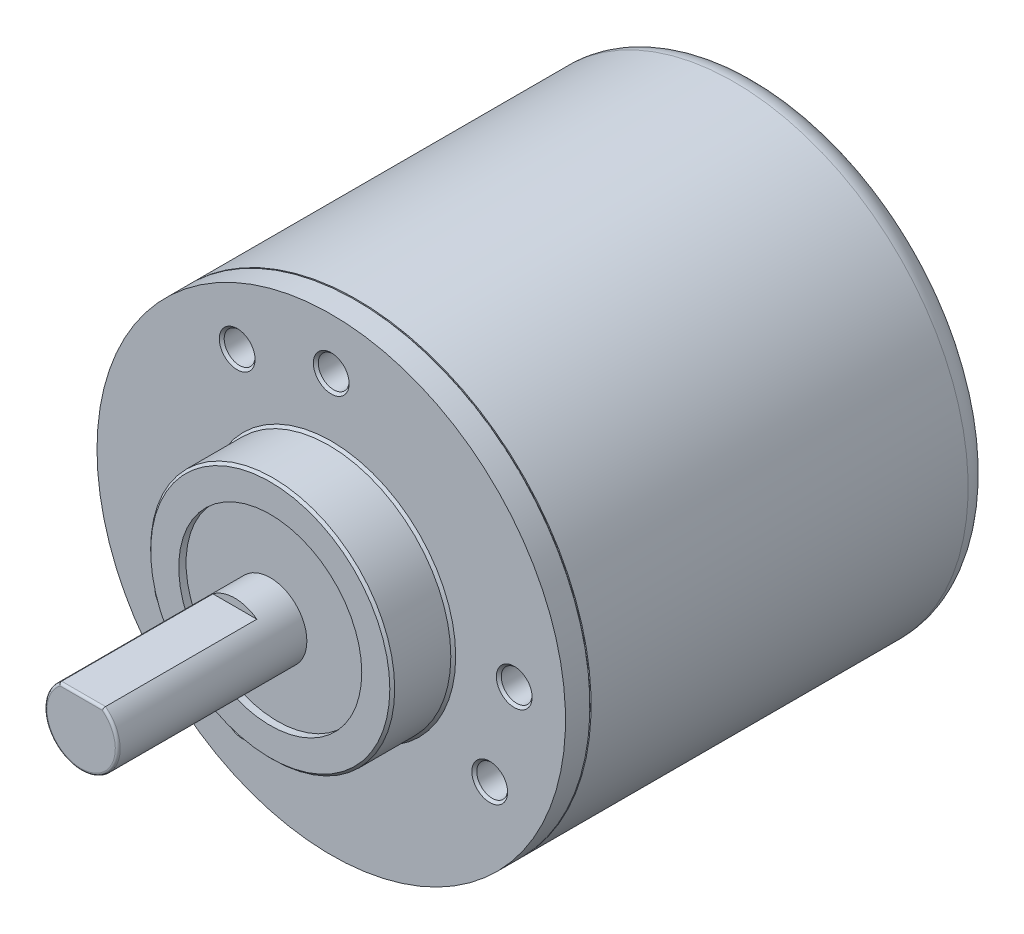
ISO-10303-21;
HEADER;
FILE_DESCRIPTION(('STEP AP214'),'2;1');
FILE_NAME('part.step','',(''),(''),'','','');
FILE_SCHEMA(('AUTOMOTIVE_DESIGN { 1 0 10303 214 1 1 1 1 }'));
ENDSEC;
DATA;
#1=APPLICATION_CONTEXT('core data for automotive mechanical design processes');
#2=APPLICATION_PROTOCOL_DEFINITION('international standard','automotive_design',2000,#1);
#3=PRODUCT_CONTEXT('',#1,'mechanical');
#4=PRODUCT('Part','Part','',(#3));
#5=PRODUCT_RELATED_PRODUCT_CATEGORY('part','',(#4));
#6=PRODUCT_DEFINITION_FORMATION('','',#4);
#7=PRODUCT_DEFINITION_CONTEXT('part definition',#1,'design');
#8=PRODUCT_DEFINITION('design','',#6,#7);
#9=PRODUCT_DEFINITION_SHAPE('','',#8);
#10=(LENGTH_UNIT() NAMED_UNIT(*) SI_UNIT(.MILLI.,.METRE.));
#11=(NAMED_UNIT(*) PLANE_ANGLE_UNIT() SI_UNIT($,.RADIAN.));
#12=(NAMED_UNIT(*) SI_UNIT($,.STERADIAN.) SOLID_ANGLE_UNIT());
#13=UNCERTAINTY_MEASURE_WITH_UNIT(LENGTH_MEASURE(1.E-05),#10,'distance_accuracy_value','');
#14=(GEOMETRIC_REPRESENTATION_CONTEXT(3) GLOBAL_UNCERTAINTY_ASSIGNED_CONTEXT((#13)) GLOBAL_UNIT_ASSIGNED_CONTEXT((#10,
#11,#12)) REPRESENTATION_CONTEXT('',''));
#15=CARTESIAN_POINT('',(0.,0.,0.));
#16=DIRECTION('',(0.,0.,1.));
#17=DIRECTION('',(1.,0.,0.));
#18=AXIS2_PLACEMENT_3D('',#15,#16,#17);
#19=CARTESIAN_POINT('',(0.,15.,28.));
#20=DIRECTION('',(0.,0.,1.));
#21=DIRECTION('',(1.,0.,0.));
#22=AXIS2_PLACEMENT_3D('',#19,#20,#21);
#23=PLANE('',#22);
#24=CARTESIAN_POINT('',(0.,15.,28.));
#25=DIRECTION('',(0.,0.,-1.));
#26=DIRECTION('',(-1.,0.,0.));
#27=AXIS2_PLACEMENT_3D('',#24,#25,#26);
#28=CIRCLE('',#27,1.2645);
#29=CARTESIAN_POINT('',(1.2645,15.,28.));
#30=VERTEX_POINT('',#29);
#31=EDGE_CURVE('P0_E255',#30,#30,#28,.T.);
#32=ORIENTED_EDGE('',*,*,#31,.F.);
#33=EDGE_LOOP('',(#32));
#34=FACE_BOUND('',#33,.T.);
#35=ADVANCED_FACE('P0_F17',(#34),#23,.T.);
#36=CARTESIAN_POINT('',(-12.9903810567666,-7.5,28.));
#37=DIRECTION('',(0.,0.,1.));
#38=DIRECTION('',(1.,0.,0.));
#39=AXIS2_PLACEMENT_3D('',#36,#37,#38);
#40=PLANE('',#39);
#41=CARTESIAN_POINT('',(-12.9903810567666,-7.5,28.));
#42=DIRECTION('',(0.,0.,-1.));
#43=DIRECTION('',(0.5,-0.866025403784439,0.));
#44=AXIS2_PLACEMENT_3D('',#41,#42,#43);
#45=CIRCLE('',#44,1.2645);
#46=CARTESIAN_POINT('',(-13.6226310567666,-6.40491087691458,28.));
#47=VERTEX_POINT('',#46);
#48=EDGE_CURVE('P0_E199',#47,#47,#45,.T.);
#49=ORIENTED_EDGE('',*,*,#48,.F.);
#50=EDGE_LOOP('',(#49));
#51=FACE_BOUND('',#50,.T.);
#52=ADVANCED_FACE('P0_F586',(#51),#40,.T.);
#53=CARTESIAN_POINT('',(12.9903810567666,-7.5,28.));
#54=DIRECTION('',(0.,0.,1.));
#55=DIRECTION('',(1.,0.,0.));
#56=AXIS2_PLACEMENT_3D('',#53,#54,#55);
#57=PLANE('',#56);
#58=CARTESIAN_POINT('',(12.9903810567666,-7.5,28.));
#59=DIRECTION('',(0.,0.,-1.));
#60=DIRECTION('',(0.5,0.866025403784438,0.));
#61=AXIS2_PLACEMENT_3D('',#58,#59,#60);
#62=CIRCLE('',#61,1.2645);
#63=CARTESIAN_POINT('',(12.3581310567666,-8.59508912308543,28.));
#64=VERTEX_POINT('',#63);
#65=EDGE_CURVE('P0_E162',#64,#64,#62,.T.);
#66=ORIENTED_EDGE('',*,*,#65,.F.);
#67=EDGE_LOOP('',(#66));
#68=FACE_BOUND('',#67,.T.);
#69=ADVANCED_FACE('P0_F517',(#68),#57,.T.);
#70=CARTESIAN_POINT('',(-7.71031055722718,12.8666666666667,28.));
#71=DIRECTION('',(0.,0.,1.));
#72=DIRECTION('',(1.,0.,0.));
#73=AXIS2_PLACEMENT_3D('',#70,#71,#72);
#74=PLANE('',#73);
#75=CARTESIAN_POINT('',(-7.71031055722718,12.8666666666667,28.));
#76=DIRECTION('',(0.,0.,-1.));
#77=DIRECTION('',(-1.,0.,0.));
#78=AXIS2_PLACEMENT_3D('',#75,#76,#77);
#79=CIRCLE('',#78,1.2645);
#80=CARTESIAN_POINT('',(-6.44581055722718,12.8666666666667,28.));
#81=VERTEX_POINT('',#80);
#82=EDGE_CURVE('P0_E251',#81,#81,#79,.T.);
#83=ORIENTED_EDGE('',*,*,#82,.F.);
#84=EDGE_LOOP('',(#83));
#85=FACE_BOUND('',#84,.T.);
#86=ADVANCED_FACE('P0_F403',(#85),#74,.T.);
#87=CARTESIAN_POINT('',(-7.2877049167462,-13.1106581469594,28.));
#88=DIRECTION('',(0.,0.,1.));
#89=DIRECTION('',(1.,0.,0.));
#90=AXIS2_PLACEMENT_3D('',#87,#88,#89);
#91=PLANE('',#90);
#92=CARTESIAN_POINT('',(-7.2877049167462,-13.1106581469594,28.));
#93=DIRECTION('',(0.,0.,-1.));
#94=DIRECTION('',(0.5,-0.866025403784439,0.));
#95=AXIS2_PLACEMENT_3D('',#92,#93,#94);
#96=CIRCLE('',#95,1.2645);
#97=CARTESIAN_POINT('',(-7.9199549167462,-12.015569023874,28.));
#98=VERTEX_POINT('',#97);
#99=EDGE_CURVE('P0_E224',#98,#98,#96,.T.);
#100=ORIENTED_EDGE('',*,*,#99,.F.);
#101=EDGE_LOOP('',(#100));
#102=FACE_BOUND('',#101,.T.);
#103=ADVANCED_FACE('P0_F397',(#102),#91,.T.);
#104=CARTESIAN_POINT('',(14.9980154739734,0.243991480292745,28.));
#105=DIRECTION('',(0.,0.,1.));
#106=DIRECTION('',(1.,0.,0.));
#107=AXIS2_PLACEMENT_3D('',#104,#105,#106);
#108=PLANE('',#107);
#109=CARTESIAN_POINT('',(14.9980154739734,0.243991480292745,28.));
#110=DIRECTION('',(0.,0.,-1.));
#111=DIRECTION('',(0.5,0.866025403784438,0.));
#112=AXIS2_PLACEMENT_3D('',#109,#110,#111);
#113=CIRCLE('',#112,1.2645);
#114=CARTESIAN_POINT('',(14.3657654739734,-0.851097642792678,28.));
#115=VERTEX_POINT('',#114);
#116=EDGE_CURVE('P0_E237',#115,#115,#113,.T.);
#117=ORIENTED_EDGE('',*,*,#116,.F.);
#118=EDGE_LOOP('',(#117));
#119=FACE_BOUND('',#118,.T.);
#120=ADVANCED_FACE('P0_F402',(#119),#108,.T.);
#121=CARTESIAN_POINT('',(0.,0.,0.));
#122=DIRECTION('',(0.,0.,1.));
#123=DIRECTION('',(1.,0.,0.));
#124=AXIS2_PLACEMENT_3D('',#121,#122,#123);
#125=PLANE('',#124);
#126=CARTESIAN_POINT('',(0.,0.,0.));
#127=DIRECTION('',(0.,0.,1.));
#128=DIRECTION('',(1.,0.,0.));
#129=AXIS2_PLACEMENT_3D('',#126,#127,#128);
#130=CIRCLE('',#129,17.2);
#131=CARTESIAN_POINT('',(-17.2,0.,0.));
#132=VERTEX_POINT('',#131);
#133=EDGE_CURVE('P0_E25',#132,#132,#130,.T.);
#134=ORIENTED_EDGE('',*,*,#133,.F.);
#135=EDGE_LOOP('',(#134));
#136=FACE_BOUND('',#135,.T.);
#137=ADVANCED_FACE('P0_F544',(#136),#125,.F.);
#138=CARTESIAN_POINT('',(0.,0.,0.));
#139=DIRECTION('',(0.,0.,1.));
#140=DIRECTION('',(1.,0.,0.));
#141=AXIS2_PLACEMENT_3D('',#138,#139,#140);
#142=CYLINDRICAL_SURFACE('',#141,19.2);
#143=CARTESIAN_POINT('',(0.,0.,32.9));
#144=DIRECTION('',(0.,0.,-1.));
#145=DIRECTION('',(1.,0.,0.));
#146=AXIS2_PLACEMENT_3D('',#143,#144,#145);
#147=CIRCLE('',#146,19.2);
#148=CARTESIAN_POINT('',(-19.2,0.,32.9));
#149=VERTEX_POINT('',#148);
#150=EDGE_CURVE('P0_E214',#149,#149,#147,.T.);
#151=ORIENTED_EDGE('',*,*,#150,.T.);
#152=DIRECTION('',(0.,0.,-1.));
#153=VECTOR('',#152,1.);
#154=CARTESIAN_POINT('',(-19.2,0.,0.));
#155=LINE('',#154,#153);
#156=CARTESIAN_POINT('',(-19.2,0.,2.));
#157=VERTEX_POINT('',#156);
#158=EDGE_CURVE('P0_E11',#149,#157,#155,.T.);
#159=ORIENTED_EDGE('',*,*,#158,.T.);
#160=CARTESIAN_POINT('',(0.,0.,2.));
#161=DIRECTION('',(0.,0.,-1.));
#162=DIRECTION('',(1.,0.,0.));
#163=AXIS2_PLACEMENT_3D('',#160,#161,#162);
#164=CIRCLE('',#163,19.2);
#165=EDGE_CURVE('P0_E307',#157,#157,#164,.T.);
#166=ORIENTED_EDGE('',*,*,#165,.F.);
#167=ORIENTED_EDGE('',*,*,#158,.F.);
#168=EDGE_LOOP('',(#151,#159,#166,#167));
#169=FACE_BOUND('',#168,.T.);
#170=ADVANCED_FACE('P0_F562',(#169),#142,.T.);
#171=CARTESIAN_POINT('',(0.,0.,2.));
#172=DIRECTION('',(0.,0.,1.));
#173=DIRECTION('',(1.,0.,0.));
#174=AXIS2_PLACEMENT_3D('',#171,#172,#173);
#175=TOROIDAL_SURFACE('',#174,17.2,2.);
#176=ORIENTED_EDGE('',*,*,#165,.T.);
#177=CARTESIAN_POINT('',(-17.2,0.,2.));
#178=DIRECTION('',(0.,-1.,0.));
#179=DIRECTION('',(-1.,0.,0.));
#180=AXIS2_PLACEMENT_3D('',#177,#178,#179);
#181=CIRCLE('',#180,2.);
#182=EDGE_CURVE('P0_E311',#157,#132,#181,.T.);
#183=ORIENTED_EDGE('',*,*,#182,.T.);
#184=ORIENTED_EDGE('',*,*,#133,.T.);
#185=ORIENTED_EDGE('',*,*,#182,.F.);
#186=EDGE_LOOP('',(#176,#183,#184,#185));
#187=FACE_BOUND('',#186,.T.);
#188=ADVANCED_FACE('P0_F553',(#187),#175,.T.);
#189=CARTESIAN_POINT('',(0.,0.,35.1));
#190=DIRECTION('',(0.,0.,-1.));
#191=DIRECTION('',(-1.,0.,0.));
#192=AXIS2_PLACEMENT_3D('',#189,#190,#191);
#193=CONICAL_SURFACE('',#192,10.1,0.785398163397448);
#194=CARTESIAN_POINT('',(0.,0.,35.));
#195=DIRECTION('',(0.,0.,1.));
#196=DIRECTION('',(-1.,0.,0.));
#197=AXIS2_PLACEMENT_3D('',#194,#195,#196);
#198=CIRCLE('',#197,10.2);
#199=CARTESIAN_POINT('',(10.2,0.,35.));
#200=VERTEX_POINT('',#199);
#201=EDGE_CURVE('P0_E183',#200,#200,#198,.T.);
#202=ORIENTED_EDGE('',*,*,#201,.T.);
#203=DIRECTION('',(-0.707106781186548,0.,0.707106781186548));
#204=VECTOR('',#203,1.);
#205=CARTESIAN_POINT('',(10.1,0.,35.1));
#206=LINE('',#205,#204);
#207=CARTESIAN_POINT('',(10.,0.,35.2));
#208=VERTEX_POINT('',#207);
#209=EDGE_CURVE('P0_E304',#200,#208,#206,.T.);
#210=ORIENTED_EDGE('',*,*,#209,.T.);
#211=CARTESIAN_POINT('',(0.,0.,35.2));
#212=DIRECTION('',(0.,0.,-1.));
#213=DIRECTION('',(-1.,0.,0.));
#214=AXIS2_PLACEMENT_3D('',#211,#212,#213);
#215=CIRCLE('',#214,10.);
#216=EDGE_CURVE('P0_E262',#208,#208,#215,.T.);
#217=ORIENTED_EDGE('',*,*,#216,.T.);
#218=ORIENTED_EDGE('',*,*,#209,.F.);
#219=EDGE_LOOP('',(#202,#210,#217,#218));
#220=FACE_BOUND('',#219,.T.);
#221=ADVANCED_FACE('P0_F535',(#220),#193,.T.);
#222=CARTESIAN_POINT('',(0.,0.,40.));
#223=DIRECTION('',(0.,0.,1.));
#224=DIRECTION('',(1.,0.,0.));
#225=AXIS2_PLACEMENT_3D('',#222,#223,#224);
#226=PLANE('',#225);
#227=CARTESIAN_POINT('',(0.,0.,40.));
#228=DIRECTION('',(0.,0.,-1.));
#229=DIRECTION('',(-1.,0.,0.));
#230=AXIS2_PLACEMENT_3D('',#227,#228,#229);
#231=CIRCLE('',#230,7.5);
#232=CARTESIAN_POINT('',(7.5,0.,40.));
#233=VERTEX_POINT('',#232);
#234=EDGE_CURVE('P0_E279',#233,#233,#231,.T.);
#235=ORIENTED_EDGE('',*,*,#234,.T.);
#236=EDGE_LOOP('',(#235));
#237=FACE_BOUND('',#236,.T.);
#238=CARTESIAN_POINT('',(0.,0.,40.));
#239=DIRECTION('',(0.,0.,-1.));
#240=DIRECTION('',(-1.,0.,0.));
#241=AXIS2_PLACEMENT_3D('',#238,#239,#240);
#242=CIRCLE('',#241,9.8);
#243=CARTESIAN_POINT('',(9.8,0.,40.));
#244=VERTEX_POINT('',#243);
#245=EDGE_CURVE('P0_E290',#244,#244,#242,.T.);
#246=ORIENTED_EDGE('',*,*,#245,.F.);
#247=EDGE_LOOP('',(#246));
#248=FACE_BOUND('',#247,.T.);
#249=ADVANCED_FACE('P0_F526',(#237,#248),#226,.T.);
#250=CARTESIAN_POINT('',(0.,0.,35.));
#251=DIRECTION('',(0.,0.,1.));
#252=DIRECTION('',(-1.,0.,0.));
#253=AXIS2_PLACEMENT_3D('',#250,#251,#252);
#254=CYLINDRICAL_SURFACE('',#253,10.);
#255=CARTESIAN_POINT('',(0.,0.,39.8));
#256=DIRECTION('',(0.,0.,1.));
#257=DIRECTION('',(-1.,0.,0.));
#258=AXIS2_PLACEMENT_3D('',#255,#256,#257);
#259=CIRCLE('',#258,10.);
#260=CARTESIAN_POINT('',(10.,0.,39.8));
#261=VERTEX_POINT('',#260);
#262=EDGE_CURVE('P0_E263',#261,#261,#259,.T.);
#263=ORIENTED_EDGE('',*,*,#262,.F.);
#264=DIRECTION('',(0.,0.,-1.));
#265=VECTOR('',#264,1.);
#266=CARTESIAN_POINT('',(10.,0.,35.));
#267=LINE('',#266,#265);
#268=EDGE_CURVE('P0_E258',#261,#208,#267,.T.);
#269=ORIENTED_EDGE('',*,*,#268,.T.);
#270=ORIENTED_EDGE('',*,*,#216,.F.);
#271=ORIENTED_EDGE('',*,*,#268,.F.);
#272=EDGE_LOOP('',(#263,#269,#270,#271));
#273=FACE_BOUND('',#272,.T.);
#274=ADVANCED_FACE('P0_F508',(#273),#254,.T.);
#275=CARTESIAN_POINT('',(0.,0.,39.9));
#276=DIRECTION('',(0.,0.,-1.));
#277=DIRECTION('',(-1.,0.,0.));
#278=AXIS2_PLACEMENT_3D('',#275,#276,#277);
#279=CONICAL_SURFACE('',#278,9.9,0.785398163397448);
#280=ORIENTED_EDGE('',*,*,#245,.T.);
#281=DIRECTION('',(0.707106781186548,0.,-0.707106781186548));
#282=VECTOR('',#281,1.);
#283=CARTESIAN_POINT('',(9.9,0.,39.9));
#284=LINE('',#283,#282);
#285=EDGE_CURVE('P0_E294',#244,#261,#284,.T.);
#286=ORIENTED_EDGE('',*,*,#285,.T.);
#287=ORIENTED_EDGE('',*,*,#262,.T.);
#288=ORIENTED_EDGE('',*,*,#285,.F.);
#289=EDGE_LOOP('',(#280,#286,#287,#288));
#290=FACE_BOUND('',#289,.T.);
#291=ADVANCED_FACE('P0_F360',(#290),#279,.T.);
#292=CARTESIAN_POINT('',(0.,0.,39.4));
#293=DIRECTION('',(0.,0.,1.));
#294=DIRECTION('',(1.,0.,0.));
#295=AXIS2_PLACEMENT_3D('',#292,#293,#294);
#296=PLANE('',#295);
#297=CARTESIAN_POINT('',(0.,0.,39.4));
#298=DIRECTION('',(0.,0.,-1.));
#299=DIRECTION('',(-1.,0.,0.));
#300=AXIS2_PLACEMENT_3D('',#297,#298,#299);
#301=CIRCLE('',#300,7.5);
#302=CARTESIAN_POINT('',(7.5,0.,39.4));
#303=VERTEX_POINT('',#302);
#304=EDGE_CURVE('P0_E287',#303,#303,#301,.T.);
#305=ORIENTED_EDGE('',*,*,#304,.F.);
#306=EDGE_LOOP('',(#305));
#307=FACE_BOUND('',#306,.T.);
#308=ADVANCED_FACE('P0_F354',(#307),#296,.T.);
#309=CARTESIAN_POINT('',(0.,0.,40.));
#310=DIRECTION('',(0.,0.,-1.));
#311=DIRECTION('',(-1.,0.,0.));
#312=AXIS2_PLACEMENT_3D('',#309,#310,#311);
#313=CYLINDRICAL_SURFACE('',#312,7.5);
#314=ORIENTED_EDGE('',*,*,#234,.F.);
#315=DIRECTION('',(0.,0.,-1.));
#316=VECTOR('',#315,1.);
#317=CARTESIAN_POINT('',(7.5,0.,40.));
#318=LINE('',#317,#316);
#319=EDGE_CURVE('P0_E283',#233,#303,#318,.T.);
#320=ORIENTED_EDGE('',*,*,#319,.T.);
#321=ORIENTED_EDGE('',*,*,#304,.T.);
#322=ORIENTED_EDGE('',*,*,#319,.F.);
#323=EDGE_LOOP('',(#314,#320,#321,#322));
#324=FACE_BOUND('',#323,.T.);
#325=ADVANCED_FACE('P0_F359',(#324),#313,.F.);
#326=CARTESIAN_POINT('',(0.,0.,0.));
#327=DIRECTION('',(0.,0.,1.));
#328=DIRECTION('',(1.,0.,0.));
#329=AXIS2_PLACEMENT_3D('',#326,#327,#328);
#330=CYLINDRICAL_SURFACE('',#329,19.2);
#331=CARTESIAN_POINT('',(0.,0.,35.));
#332=DIRECTION('',(0.,0.,1.));
#333=DIRECTION('',(1.,0.,0.));
#334=AXIS2_PLACEMENT_3D('',#331,#332,#333);
#335=CIRCLE('',#334,19.2);
#336=CARTESIAN_POINT('',(-19.2,0.,35.));
#337=VERTEX_POINT('',#336);
#338=EDGE_CURVE('P0_E719',#337,#337,#335,.T.);
#339=ORIENTED_EDGE('',*,*,#338,.F.);
#340=DIRECTION('',(0.,0.,-1.));
#341=VECTOR('',#340,1.);
#342=CARTESIAN_POINT('',(-19.2,0.,0.));
#343=LINE('',#342,#341);
#344=CARTESIAN_POINT('',(-19.2,0.,33.));
#345=VERTEX_POINT('',#344);
#346=EDGE_CURVE('P0_E276',#337,#345,#343,.T.);
#347=ORIENTED_EDGE('',*,*,#346,.T.);
#348=CARTESIAN_POINT('',(0.,0.,33.));
#349=DIRECTION('',(0.,0.,1.));
#350=DIRECTION('',(1.,0.,0.));
#351=AXIS2_PLACEMENT_3D('',#348,#349,#350);
#352=CIRCLE('',#351,19.2);
#353=EDGE_CURVE('P0_E272',#345,#345,#352,.T.);
#354=ORIENTED_EDGE('',*,*,#353,.T.);
#355=ORIENTED_EDGE('',*,*,#346,.F.);
#356=EDGE_LOOP('',(#339,#347,#354,#355));
#357=FACE_BOUND('',#356,.T.);
#358=ADVANCED_FACE('P0_F485',(#357),#330,.T.);
#359=CARTESIAN_POINT('',(0.,19.2,33.));
#360=DIRECTION('',(0.,0.,1.));
#361=DIRECTION('',(1.,0.,0.));
#362=AXIS2_PLACEMENT_3D('',#359,#360,#361);
#363=PLANE('',#362);
#364=CARTESIAN_POINT('',(0.,0.,33.));
#365=DIRECTION('',(0.,0.,-1.));
#366=DIRECTION('',(1.,0.,0.));
#367=AXIS2_PLACEMENT_3D('',#364,#365,#366);
#368=CIRCLE('',#367,19.1);
#369=CARTESIAN_POINT('',(0.,-19.1,33.));
#370=VERTEX_POINT('',#369);
#371=EDGE_CURVE('P0_E213',#370,#370,#368,.T.);
#372=ORIENTED_EDGE('',*,*,#371,.F.);
#373=EDGE_LOOP('',(#372));
#374=FACE_BOUND('',#373,.T.);
#375=ORIENTED_EDGE('',*,*,#353,.F.);
#376=EDGE_LOOP('',(#375));
#377=FACE_BOUND('',#376,.T.);
#378=ADVANCED_FACE('P0_F476',(#374,#377),#363,.F.);
#379=CARTESIAN_POINT('',(0.,0.,32.95));
#380=DIRECTION('',(0.,0.,-1.));
#381=DIRECTION('',(0.,1.,0.));
#382=AXIS2_PLACEMENT_3D('',#379,#380,#381);
#383=CYLINDRICAL_SURFACE('',#382,19.1);
#384=ORIENTED_EDGE('',*,*,#371,.T.);
#385=DIRECTION('',(0.,0.,-1.));
#386=VECTOR('',#385,1.);
#387=CARTESIAN_POINT('',(0.,-19.1,32.95));
#388=LINE('',#387,#386);
#389=CARTESIAN_POINT('',(0.,-19.1,32.9));
#390=VERTEX_POINT('',#389);
#391=EDGE_CURVE('P0_E269',#370,#390,#388,.T.);
#392=ORIENTED_EDGE('',*,*,#391,.T.);
#393=CARTESIAN_POINT('',(0.,0.,32.9));
#394=DIRECTION('',(0.,0.,-1.));
#395=DIRECTION('',(1.,0.,0.));
#396=AXIS2_PLACEMENT_3D('',#393,#394,#395);
#397=CIRCLE('',#396,19.1);
#398=EDGE_CURVE('P0_E209',#390,#390,#397,.T.);
#399=ORIENTED_EDGE('',*,*,#398,.F.);
#400=ORIENTED_EDGE('',*,*,#391,.F.);
#401=EDGE_LOOP('',(#384,#392,#399,#400));
#402=FACE_BOUND('',#401,.T.);
#403=ADVANCED_FACE('P0_F347',(#402),#383,.T.);
#404=CARTESIAN_POINT('',(0.,19.1,32.9));
#405=DIRECTION('',(0.,0.,-1.));
#406=DIRECTION('',(0.,-1.,0.));
#407=AXIS2_PLACEMENT_3D('',#404,#405,#406);
#408=PLANE('',#407);
#409=ORIENTED_EDGE('',*,*,#398,.T.);
#410=EDGE_LOOP('',(#409));
#411=FACE_BOUND('',#410,.T.);
#412=ORIENTED_EDGE('',*,*,#150,.F.);
#413=EDGE_LOOP('',(#412));
#414=FACE_BOUND('',#413,.T.);
#415=ADVANCED_FACE('P0_F341',(#411,#414),#408,.F.);
#416=CARTESIAN_POINT('',(0.,15.,35.));
#417=DIRECTION('',(0.,0.,-1.));
#418=DIRECTION('',(-1.,0.,0.));
#419=AXIS2_PLACEMENT_3D('',#416,#417,#418);
#420=CYLINDRICAL_SURFACE('',#419,1.2645);
#421=CARTESIAN_POINT('',(0.,15.,34.8));
#422=DIRECTION('',(0.,0.,-1.));
#423=DIRECTION('',(-1.,0.,0.));
#424=AXIS2_PLACEMENT_3D('',#421,#422,#423);
#425=CIRCLE('',#424,1.2645);
#426=CARTESIAN_POINT('',(1.2645,15.,34.8));
#427=VERTEX_POINT('',#426);
#428=EDGE_CURVE('P0_E204',#427,#427,#425,.T.);
#429=ORIENTED_EDGE('',*,*,#428,.F.);
#430=DIRECTION('',(0.,0.,-1.));
#431=VECTOR('',#430,1.);
#432=CARTESIAN_POINT('',(1.2645,15.,35.));
#433=LINE('',#432,#431);
#434=EDGE_CURVE('P0_E203',#427,#30,#433,.T.);
#435=ORIENTED_EDGE('',*,*,#434,.T.);
#436=ORIENTED_EDGE('',*,*,#31,.T.);
#437=ORIENTED_EDGE('',*,*,#434,.F.);
#438=EDGE_LOOP('',(#429,#435,#436,#437));
#439=FACE_BOUND('',#438,.T.);
#440=ADVANCED_FACE('P0_F346',(#439),#420,.F.);
#441=CARTESIAN_POINT('',(0.,15.,34.9));
#442=DIRECTION('',(0.,0.,1.));
#443=DIRECTION('',(-1.,0.,0.));
#444=AXIS2_PLACEMENT_3D('',#441,#442,#443);
#445=CONICAL_SURFACE('',#444,1.3645,0.785398163397448);
#446=ORIENTED_EDGE('',*,*,#428,.T.);
#447=DIRECTION('',(0.707106781186548,0.,0.707106781186548));
#448=VECTOR('',#447,1.);
#449=CARTESIAN_POINT('',(1.3645,15.,34.9));
#450=LINE('',#449,#448);
#451=CARTESIAN_POINT('',(1.4645,15.,35.));
#452=VERTEX_POINT('',#451);
#453=EDGE_CURVE('P0_E200',#427,#452,#450,.T.);
#454=ORIENTED_EDGE('',*,*,#453,.T.);
#455=CARTESIAN_POINT('',(0.,15.,35.));
#456=DIRECTION('',(0.,0.,1.));
#457=DIRECTION('',(-1.,0.,0.));
#458=AXIS2_PLACEMENT_3D('',#455,#456,#457);
#459=CIRCLE('',#458,1.4645);
#460=EDGE_CURVE('P0_E717',#452,#452,#459,.T.);
#461=ORIENTED_EDGE('',*,*,#460,.T.);
#462=ORIENTED_EDGE('',*,*,#453,.F.);
#463=EDGE_LOOP('',(#446,#454,#461,#462));
#464=FACE_BOUND('',#463,.T.);
#465=ADVANCED_FACE('P0_F450',(#464),#445,.F.);
#466=CARTESIAN_POINT('',(-7.71031055722718,12.8666666666667,35.));
#467=DIRECTION('',(0.,0.,-1.));
#468=DIRECTION('',(-1.,0.,0.));
#469=AXIS2_PLACEMENT_3D('',#466,#467,#468);
#470=CYLINDRICAL_SURFACE('',#469,1.2645);
#471=CARTESIAN_POINT('',(-7.71031055722718,12.8666666666667,34.8));
#472=DIRECTION('',(0.,0.,-1.));
#473=DIRECTION('',(-1.,0.,0.));
#474=AXIS2_PLACEMENT_3D('',#471,#472,#473);
#475=CIRCLE('',#474,1.2645);
#476=CARTESIAN_POINT('',(-6.44581055722718,12.8666666666667,34.8));
#477=VERTEX_POINT('',#476);
#478=EDGE_CURVE('P0_E240',#477,#477,#475,.T.);
#479=ORIENTED_EDGE('',*,*,#478,.F.);
#480=DIRECTION('',(0.,0.,-1.));
#481=VECTOR('',#480,1.);
#482=CARTESIAN_POINT('',(-6.44581055722718,12.8666666666667,35.));
#483=LINE('',#482,#481);
#484=EDGE_CURVE('P0_E247',#477,#81,#483,.T.);
#485=ORIENTED_EDGE('',*,*,#484,.T.);
#486=ORIENTED_EDGE('',*,*,#82,.T.);
#487=ORIENTED_EDGE('',*,*,#484,.F.);
#488=EDGE_LOOP('',(#479,#485,#486,#487));
#489=FACE_BOUND('',#488,.T.);
#490=ADVANCED_FACE('P0_F422',(#489),#470,.F.);
#491=CARTESIAN_POINT('',(-7.71031055722718,12.8666666666667,34.9));
#492=DIRECTION('',(0.,0.,1.));
#493=DIRECTION('',(-1.,0.,0.));
#494=AXIS2_PLACEMENT_3D('',#491,#492,#493);
#495=CONICAL_SURFACE('',#494,1.3645,0.785398163397448);
#496=ORIENTED_EDGE('',*,*,#478,.T.);
#497=DIRECTION('',(0.707106781186548,0.,0.707106781186548));
#498=VECTOR('',#497,1.);
#499=CARTESIAN_POINT('',(-6.34581055722718,12.8666666666667,34.9));
#500=LINE('',#499,#498);
#501=CARTESIAN_POINT('',(-6.24581055722718,12.8666666666667,35.));
#502=VERTEX_POINT('',#501);
#503=EDGE_CURVE('P0_E244',#477,#502,#500,.T.);
#504=ORIENTED_EDGE('',*,*,#503,.T.);
#505=CARTESIAN_POINT('',(-7.71031055722718,12.8666666666667,35.));
#506=DIRECTION('',(0.,0.,1.));
#507=DIRECTION('',(-1.,0.,0.));
#508=AXIS2_PLACEMENT_3D('',#505,#506,#507);
#509=CIRCLE('',#508,1.4645);
#510=EDGE_CURVE('P0_E189',#502,#502,#509,.T.);
#511=ORIENTED_EDGE('',*,*,#510,.T.);
#512=ORIENTED_EDGE('',*,*,#503,.F.);
#513=EDGE_LOOP('',(#496,#504,#511,#512));
#514=FACE_BOUND('',#513,.T.);
#515=ADVANCED_FACE('P0_F382',(#514),#495,.F.);
#516=CARTESIAN_POINT('',(14.9980154739734,0.243991480292745,35.));
#517=DIRECTION('',(0.,0.,-1.));
#518=DIRECTION('',(0.5,0.866025403784438,0.));
#519=AXIS2_PLACEMENT_3D('',#516,#517,#518);
#520=CYLINDRICAL_SURFACE('',#519,1.2645);
#521=CARTESIAN_POINT('',(14.9980154739734,0.243991480292745,34.8));
#522=DIRECTION('',(0.,0.,-1.));
#523=DIRECTION('',(0.5,0.866025403784439,0.));
#524=AXIS2_PLACEMENT_3D('',#521,#522,#523);
#525=CIRCLE('',#524,1.2645);
#526=CARTESIAN_POINT('',(14.3657654739734,-0.851097642792678,34.8));
#527=VERTEX_POINT('',#526);
#528=EDGE_CURVE('P0_E169',#527,#527,#525,.T.);
#529=ORIENTED_EDGE('',*,*,#528,.F.);
#530=DIRECTION('',(0.,0.,-1.));
#531=VECTOR('',#530,1.);
#532=CARTESIAN_POINT('',(14.3657654739734,-0.851097642792678,35.));
#533=LINE('',#532,#531);
#534=EDGE_CURVE('P0_E233',#527,#115,#533,.T.);
#535=ORIENTED_EDGE('',*,*,#534,.T.);
#536=ORIENTED_EDGE('',*,*,#116,.T.);
#537=ORIENTED_EDGE('',*,*,#534,.F.);
#538=EDGE_LOOP('',(#529,#535,#536,#537));
#539=FACE_BOUND('',#538,.T.);
#540=ADVANCED_FACE('P0_F376',(#539),#520,.F.);
#541=CARTESIAN_POINT('',(14.9980154739734,0.243991480292745,34.9));
#542=DIRECTION('',(0.,0.,1.));
#543=DIRECTION('',(0.5,0.866025403784439,0.));
#544=AXIS2_PLACEMENT_3D('',#541,#542,#543);
#545=CONICAL_SURFACE('',#544,1.3645,0.785398163397448);
#546=ORIENTED_EDGE('',*,*,#528,.T.);
#547=DIRECTION('',(-0.353553390593275,-0.612372435695794,0.707106781186548));
#548=VECTOR('',#547,1.);
#549=CARTESIAN_POINT('',(14.3157654739734,-0.937700183171122,34.9));
#550=LINE('',#549,#548);
#551=CARTESIAN_POINT('',(14.2657654739734,-1.02430272354957,35.));
#552=VERTEX_POINT('',#551);
#553=EDGE_CURVE('P0_E176',#527,#552,#550,.T.);
#554=ORIENTED_EDGE('',*,*,#553,.T.);
#555=CARTESIAN_POINT('',(14.9980154739734,0.243991480292745,35.));
#556=DIRECTION('',(0.,0.,1.));
#557=DIRECTION('',(0.5,0.866025403784439,0.));
#558=AXIS2_PLACEMENT_3D('',#555,#556,#557);
#559=CIRCLE('',#558,1.4645);
#560=EDGE_CURVE('P0_E185',#552,#552,#559,.T.);
#561=ORIENTED_EDGE('',*,*,#560,.T.);
#562=ORIENTED_EDGE('',*,*,#553,.F.);
#563=EDGE_LOOP('',(#546,#554,#561,#562));
#564=FACE_BOUND('',#563,.T.);
#565=ADVANCED_FACE('P0_F381',(#564),#545,.F.);
#566=CARTESIAN_POINT('',(12.9903810567666,-7.5,35.));
#567=DIRECTION('',(0.,0.,-1.));
#568=DIRECTION('',(0.5,0.866025403784438,0.));
#569=AXIS2_PLACEMENT_3D('',#566,#567,#568);
#570=CYLINDRICAL_SURFACE('',#569,1.2645);
#571=CARTESIAN_POINT('',(12.9903810567666,-7.5,34.8));
#572=DIRECTION('',(0.,0.,-1.));
#573=DIRECTION('',(0.5,0.866025403784439,0.));
#574=AXIS2_PLACEMENT_3D('',#571,#572,#573);
#575=CIRCLE('',#574,1.2645);
#576=CARTESIAN_POINT('',(12.3581310567666,-8.59508912308543,34.8));
#577=VERTEX_POINT('',#576);
#578=EDGE_CURVE('P0_E225',#577,#577,#575,.T.);
#579=ORIENTED_EDGE('',*,*,#578,.F.);
#580=DIRECTION('',(0.,0.,-1.));
#581=VECTOR('',#580,1.);
#582=CARTESIAN_POINT('',(12.3581310567666,-8.59508912308543,35.));
#583=LINE('',#582,#581);
#584=EDGE_CURVE('P0_E165',#577,#64,#583,.T.);
#585=ORIENTED_EDGE('',*,*,#584,.T.);
#586=ORIENTED_EDGE('',*,*,#65,.T.);
#587=ORIENTED_EDGE('',*,*,#584,.F.);
#588=EDGE_LOOP('',(#579,#585,#586,#587));
#589=FACE_BOUND('',#588,.T.);
#590=ADVANCED_FACE('P0_F164',(#589),#570,.F.);
#591=CARTESIAN_POINT('',(12.9903810567666,-7.5,34.9));
#592=DIRECTION('',(0.,0.,1.));
#593=DIRECTION('',(0.5,0.866025403784439,0.));
#594=AXIS2_PLACEMENT_3D('',#591,#592,#593);
#595=CONICAL_SURFACE('',#594,1.3645,0.785398163397448);
#596=ORIENTED_EDGE('',*,*,#578,.T.);
#597=DIRECTION('',(-0.353553390593274,-0.612372435695794,0.707106781186548));
#598=VECTOR('',#597,1.);
#599=CARTESIAN_POINT('',(12.3081310567666,-8.68169166346387,34.9));
#600=LINE('',#599,#598);
#601=CARTESIAN_POINT('',(12.2581310567666,-8.76829420384232,35.));
#602=VERTEX_POINT('',#601);
#603=EDGE_CURVE('P0_E179',#577,#602,#600,.T.);
#604=ORIENTED_EDGE('',*,*,#603,.T.);
#605=CARTESIAN_POINT('',(12.9903810567666,-7.5,35.));
#606=DIRECTION('',(0.,0.,1.));
#607=DIRECTION('',(0.5,0.866025403784439,0.));
#608=AXIS2_PLACEMENT_3D('',#605,#606,#607);
#609=CIRCLE('',#608,1.4645);
#610=EDGE_CURVE('P0_E188',#602,#602,#609,.T.);
#611=ORIENTED_EDGE('',*,*,#610,.T.);
#612=ORIENTED_EDGE('',*,*,#603,.F.);
#613=EDGE_LOOP('',(#596,#604,#611,#612));
#614=FACE_BOUND('',#613,.T.);
#615=ADVANCED_FACE('P0_F431',(#614),#595,.F.);
#616=CARTESIAN_POINT('',(-7.2877049167462,-13.1106581469594,35.));
#617=DIRECTION('',(0.,0.,-1.));
#618=DIRECTION('',(0.5,-0.866025403784439,0.));
#619=AXIS2_PLACEMENT_3D('',#616,#617,#618);
#620=CYLINDRICAL_SURFACE('',#619,1.2645);
#621=CARTESIAN_POINT('',(-7.2877049167462,-13.1106581469594,34.8));
#622=DIRECTION('',(0.,0.,-1.));
#623=DIRECTION('',(0.5,-0.866025403784439,0.));
#624=AXIS2_PLACEMENT_3D('',#621,#622,#623);
#625=CIRCLE('',#624,1.2645);
#626=CARTESIAN_POINT('',(-7.9199549167462,-12.015569023874,34.8));
#627=VERTEX_POINT('',#626);
#628=EDGE_CURVE('P0_E194',#627,#627,#625,.T.);
#629=ORIENTED_EDGE('',*,*,#628,.F.);
#630=DIRECTION('',(0.,0.,-1.));
#631=VECTOR('',#630,1.);
#632=CARTESIAN_POINT('',(-7.9199549167462,-12.015569023874,35.));
#633=LINE('',#632,#631);
#634=EDGE_CURVE('P0_E220',#627,#98,#633,.T.);
#635=ORIENTED_EDGE('',*,*,#634,.T.);
#636=ORIENTED_EDGE('',*,*,#99,.T.);
#637=ORIENTED_EDGE('',*,*,#634,.F.);
#638=EDGE_LOOP('',(#629,#635,#636,#637));
#639=FACE_BOUND('',#638,.T.);
#640=ADVANCED_FACE('P0_F413',(#639),#620,.F.);
#641=CARTESIAN_POINT('',(-7.2877049167462,-13.1106581469594,34.9));
#642=DIRECTION('',(0.,0.,1.));
#643=DIRECTION('',(0.5,-0.866025403784439,0.));
#644=AXIS2_PLACEMENT_3D('',#641,#642,#643);
#645=CONICAL_SURFACE('',#644,1.3645,0.78539816339745);
#646=ORIENTED_EDGE('',*,*,#628,.T.);
#647=DIRECTION('',(-0.353553390593274,0.612372435695796,0.707106781186546));
#648=VECTOR('',#647,1.);
#649=CARTESIAN_POINT('',(-7.9699549167462,-11.9289664834956,34.9));
#650=LINE('',#649,#648);
#651=CARTESIAN_POINT('',(-8.0199549167462,-11.8423639431171,35.));
#652=VERTEX_POINT('',#651);
#653=EDGE_CURVE('P0_E198',#627,#652,#650,.T.);
#654=ORIENTED_EDGE('',*,*,#653,.T.);
#655=CARTESIAN_POINT('',(-7.2877049167462,-13.1106581469594,35.));
#656=DIRECTION('',(0.,0.,1.));
#657=DIRECTION('',(0.5,-0.866025403784439,0.));
#658=AXIS2_PLACEMENT_3D('',#655,#656,#657);
#659=CIRCLE('',#658,1.4645);
#660=EDGE_CURVE('P0_E193',#652,#652,#659,.T.);
#661=ORIENTED_EDGE('',*,*,#660,.T.);
#662=ORIENTED_EDGE('',*,*,#653,.F.);
#663=EDGE_LOOP('',(#646,#654,#661,#662));
#664=FACE_BOUND('',#663,.T.);
#665=ADVANCED_FACE('P0_F370',(#664),#645,.F.);
#666=CARTESIAN_POINT('',(-12.9903810567666,-7.5,35.));
#667=DIRECTION('',(0.,0.,-1.));
#668=DIRECTION('',(0.5,-0.866025403784439,0.));
#669=AXIS2_PLACEMENT_3D('',#666,#667,#668);
#670=CYLINDRICAL_SURFACE('',#669,1.2645);
#671=CARTESIAN_POINT('',(-12.9903810567666,-7.5,34.8));
#672=DIRECTION('',(0.,0.,-1.));
#673=DIRECTION('',(0.5,-0.866025403784439,0.));
#674=AXIS2_PLACEMENT_3D('',#671,#672,#673);
#675=CIRCLE('',#674,1.2645);
#676=CARTESIAN_POINT('',(-13.6226310567666,-6.40491087691458,34.8));
#677=VERTEX_POINT('',#676);
#678=EDGE_CURVE('P0_E737',#677,#677,#675,.T.);
#679=ORIENTED_EDGE('',*,*,#678,.F.);
#680=DIRECTION('',(0.,0.,-1.));
#681=VECTOR('',#680,1.);
#682=CARTESIAN_POINT('',(-13.6226310567666,-6.40491087691458,35.));
#683=LINE('',#682,#681);
#684=EDGE_CURVE('P0_E208',#677,#47,#683,.T.);
#685=ORIENTED_EDGE('',*,*,#684,.T.);
#686=ORIENTED_EDGE('',*,*,#48,.T.);
#687=ORIENTED_EDGE('',*,*,#684,.F.);
#688=EDGE_LOOP('',(#679,#685,#686,#687));
#689=FACE_BOUND('',#688,.T.);
#690=ADVANCED_FACE('P0_F335',(#689),#670,.F.);
#691=CARTESIAN_POINT('',(0.,0.,35.));
#692=DIRECTION('',(0.,0.,1.));
#693=DIRECTION('',(1.,0.,0.));
#694=AXIS2_PLACEMENT_3D('',#691,#692,#693);
#695=PLANE('',#694);
#696=CARTESIAN_POINT('',(-12.9903810567666,-7.5,35.));
#697=DIRECTION('',(0.,0.,1.));
#698=DIRECTION('',(0.5,-0.866025403784439,0.));
#699=AXIS2_PLACEMENT_3D('',#696,#697,#698);
#700=CIRCLE('',#699,1.4645);
#701=CARTESIAN_POINT('',(-13.7226310567666,-6.23170579615769,35.));
#702=VERTEX_POINT('',#701);
#703=EDGE_CURVE('P0_E723',#702,#702,#700,.T.);
#704=ORIENTED_EDGE('',*,*,#703,.F.);
#705=EDGE_LOOP('',(#704));
#706=FACE_BOUND('',#705,.T.);
#707=ORIENTED_EDGE('',*,*,#660,.F.);
#708=EDGE_LOOP('',(#707));
#709=FACE_BOUND('',#708,.T.);
#710=ORIENTED_EDGE('',*,*,#610,.F.);
#711=EDGE_LOOP('',(#710));
#712=FACE_BOUND('',#711,.T.);
#713=ORIENTED_EDGE('',*,*,#560,.F.);
#714=EDGE_LOOP('',(#713));
#715=FACE_BOUND('',#714,.T.);
#716=ORIENTED_EDGE('',*,*,#510,.F.);
#717=EDGE_LOOP('',(#716));
#718=FACE_BOUND('',#717,.T.);
#719=ORIENTED_EDGE('',*,*,#460,.F.);
#720=EDGE_LOOP('',(#719));
#721=FACE_BOUND('',#720,.T.);
#722=ORIENTED_EDGE('',*,*,#201,.F.);
#723=EDGE_LOOP('',(#722));
#724=FACE_BOUND('',#723,.T.);
#725=ORIENTED_EDGE('',*,*,#338,.T.);
#726=EDGE_LOOP('',(#725));
#727=FACE_BOUND('',#726,.T.);
#728=ADVANCED_FACE('P0_F325',(#706,#709,#712,#715,#718,#721,#724,#727),#695,.T.);
#729=CARTESIAN_POINT('',(-12.9903810567666,-7.5,34.9));
#730=DIRECTION('',(0.,0.,1.));
#731=DIRECTION('',(0.5,-0.866025403784439,0.));
#732=AXIS2_PLACEMENT_3D('',#729,#730,#731);
#733=CONICAL_SURFACE('',#732,1.3645,0.78539816339745);
#734=ORIENTED_EDGE('',*,*,#678,.T.);
#735=DIRECTION('',(-0.353553390593274,0.612372435695796,0.707106781186546));
#736=VECTOR('',#735,1.);
#737=CARTESIAN_POINT('',(-13.6726310567666,-6.31830833653613,34.9));
#738=LINE('',#737,#736);
#739=EDGE_CURVE('P0_E731',#677,#702,#738,.T.);
#740=ORIENTED_EDGE('',*,*,#739,.T.);
#741=ORIENTED_EDGE('',*,*,#703,.T.);
#742=ORIENTED_EDGE('',*,*,#739,.F.);
#743=EDGE_LOOP('',(#734,#740,#741,#742));
#744=FACE_BOUND('',#743,.T.);
#745=ADVANCED_FACE('P0_F320',(#744),#733,.F.);
#746=CLOSED_SHELL('',(#35,#52,#69,#86,#103,#120,#137,#170,#188,#221,#249,#274,#291,#308,#325,
#358,#378,#403,#415,#440,#465,#490,#515,#540,#565,#590,#615,#640,#665,#690,#728,#745));
#747=MANIFOLD_SOLID_BREP('P0_B1',#746);
#748=CARTESIAN_POINT('',(0.,0.,40.));
#749=DIRECTION('',(0.,0.,1.));
#750=DIRECTION('',(1.,0.,0.));
#751=AXIS2_PLACEMENT_3D('',#748,#749,#750);
#752=PLANE('',#751);
#753=CARTESIAN_POINT('',(0.,0.,40.));
#754=DIRECTION('',(0.,0.,-1.));
#755=DIRECTION('',(-1.,0.,0.));
#756=AXIS2_PLACEMENT_3D('',#753,#754,#755);
#757=CIRCLE('',#756,3.);
#758=CARTESIAN_POINT('',(3.,0.,40.));
#759=VERTEX_POINT('',#758);
#760=EDGE_CURVE('P1_E21',#759,#759,#757,.T.);
#761=ORIENTED_EDGE('',*,*,#760,.T.);
#762=EDGE_LOOP('',(#761));
#763=FACE_BOUND('',#762,.T.);
#764=ADVANCED_FACE('P1_F17',(#763),#752,.F.);
#765=CARTESIAN_POINT('',(0.,2.7,42.9));
#766=DIRECTION('',(0.,0.,1.));
#767=DIRECTION('',(1.,0.,0.));
#768=AXIS2_PLACEMENT_3D('',#765,#766,#767);
#769=PLANE('',#768);
#770=DIRECTION('',(-1.,0.,0.));
#771=VECTOR('',#770,1.);
#772=CARTESIAN_POINT('',(-1.8,2.4,42.9));
#773=LINE('',#772,#771);
#774=CARTESIAN_POINT('',(1.8,2.4,42.9));
#775=VERTEX_POINT('',#774);
#776=CARTESIAN_POINT('',(-1.8,2.4,42.9));
#777=VERTEX_POINT('',#776);
#778=EDGE_CURVE('P1_E11',#775,#777,#773,.T.);
#779=ORIENTED_EDGE('',*,*,#778,.F.);
#780=CARTESIAN_POINT('',(0.,0.,42.9));
#781=DIRECTION('',(0.,0.,-1.));
#782=DIRECTION('',(-1.,0.,0.));
#783=AXIS2_PLACEMENT_3D('',#780,#781,#782);
#784=CIRCLE('',#783,3.);
#785=EDGE_CURVE('P1_E102',#777,#775,#784,.T.);
#786=ORIENTED_EDGE('',*,*,#785,.F.);
#787=EDGE_LOOP('',(#779,#786));
#788=FACE_BOUND('',#787,.T.);
#789=ADVANCED_FACE('P1_F19',(#788),#769,.T.);
#790=CARTESIAN_POINT('',(1.8,2.4,55.5));
#791=DIRECTION('',(0.,-1.,0.));
#792=DIRECTION('',(0.,0.,-1.));
#793=AXIS2_PLACEMENT_3D('',#790,#791,#792);
#794=PLANE('',#793);
#795=DIRECTION('',(-1.,0.,0.));
#796=VECTOR('',#795,1.);
#797=CARTESIAN_POINT('',(0.9,2.4,55.3));
#798=LINE('',#797,#796);
#799=CARTESIAN_POINT('',(1.8,2.4,55.3));
#800=VERTEX_POINT('',#799);
#801=CARTESIAN_POINT('',(-1.8,2.4,55.3));
#802=VERTEX_POINT('',#801);
#803=EDGE_CURVE('P1_E83',#800,#802,#798,.T.);
#804=ORIENTED_EDGE('',*,*,#803,.F.);
#805=DIRECTION('',(0.,0.,1.));
#806=VECTOR('',#805,1.);
#807=CARTESIAN_POINT('',(1.8,2.4,40.));
#808=LINE('',#807,#806);
#809=EDGE_CURVE('P1_E123',#775,#800,#808,.T.);
#810=ORIENTED_EDGE('',*,*,#809,.F.);
#811=ORIENTED_EDGE('',*,*,#778,.T.);
#812=DIRECTION('',(0.,0.,-1.));
#813=VECTOR('',#812,1.);
#814=CARTESIAN_POINT('',(-1.8,2.4,40.));
#815=LINE('',#814,#813);
#816=EDGE_CURVE('P1_E82',#802,#777,#815,.T.);
#817=ORIENTED_EDGE('',*,*,#816,.F.);
#818=EDGE_LOOP('',(#804,#810,#811,#817));
#819=FACE_BOUND('',#818,.T.);
#820=ADVANCED_FACE('P1_F171',(#819),#794,.F.);
#821=CARTESIAN_POINT('',(0.,0.,55.5));
#822=DIRECTION('',(0.,0.,1.));
#823=DIRECTION('',(1.,0.,0.));
#824=AXIS2_PLACEMENT_3D('',#821,#822,#823);
#825=PLANE('',#824);
#826=CARTESIAN_POINT('',(0.,0.,55.5));
#827=DIRECTION('',(0.,0.,-1.));
#828=DIRECTION('',(0.,-1.,0.));
#829=AXIS2_PLACEMENT_3D('',#826,#827,#828);
#830=CIRCLE('',#829,2.8);
#831=CARTESIAN_POINT('',(1.73205080756888,2.2,55.5));
#832=VERTEX_POINT('',#831);
#833=CARTESIAN_POINT('',(-1.73205080756888,2.2,55.5));
#834=VERTEX_POINT('',#833);
#835=EDGE_CURVE('P1_E87',#832,#834,#830,.T.);
#836=ORIENTED_EDGE('',*,*,#835,.F.);
#837=DIRECTION('',(1.,0.,0.));
#838=VECTOR('',#837,1.);
#839=CARTESIAN_POINT('',(0.9,2.2,55.5));
#840=LINE('',#839,#838);
#841=EDGE_CURVE('P1_E70',#834,#832,#840,.T.);
#842=ORIENTED_EDGE('',*,*,#841,.F.);
#843=EDGE_LOOP('',(#836,#842));
#844=FACE_BOUND('',#843,.T.);
#845=ADVANCED_FACE('P1_F93',(#844),#825,.T.);
#846=CARTESIAN_POINT('',(0.,0.,40.));
#847=DIRECTION('',(0.,0.,1.));
#848=DIRECTION('',(-1.,0.,0.));
#849=AXIS2_PLACEMENT_3D('',#846,#847,#848);
#850=CYLINDRICAL_SURFACE('',#849,3.);
#851=CARTESIAN_POINT('',(0.,0.,55.3));
#852=DIRECTION('',(0.,0.,1.));
#853=DIRECTION('',(0.,-1.,0.));
#854=AXIS2_PLACEMENT_3D('',#851,#852,#853);
#855=CIRCLE('',#854,3.);
#856=CARTESIAN_POINT('',(3.,0.,55.3));
#857=VERTEX_POINT('',#856);
#858=EDGE_CURVE('P1_E99',#802,#857,#855,.T.);
#859=ORIENTED_EDGE('',*,*,#858,.F.);
#860=ORIENTED_EDGE('',*,*,#816,.T.);
#861=ORIENTED_EDGE('',*,*,#785,.T.);
#862=ORIENTED_EDGE('',*,*,#809,.T.);
#863=CARTESIAN_POINT('',(0.,0.,55.3));
#864=DIRECTION('',(0.,0.,1.));
#865=DIRECTION('',(0.,-1.,0.));
#866=AXIS2_PLACEMENT_3D('',#863,#864,#865);
#867=CIRCLE('',#866,3.);
#868=EDGE_CURVE('P1_E90',#857,#800,#867,.T.);
#869=ORIENTED_EDGE('',*,*,#868,.F.);
#870=DIRECTION('',(0.,0.,-1.));
#871=VECTOR('',#870,1.);
#872=CARTESIAN_POINT('',(3.,0.,40.));
#873=LINE('',#872,#871);
#874=EDGE_CURVE('P1_E125',#857,#759,#873,.T.);
#875=ORIENTED_EDGE('',*,*,#874,.T.);
#876=ORIENTED_EDGE('',*,*,#760,.F.);
#877=ORIENTED_EDGE('',*,*,#874,.F.);
#878=EDGE_LOOP('',(#859,#860,#861,#862,#869,#875,#876,#877));
#879=FACE_BOUND('',#878,.T.);
#880=ADVANCED_FACE('P1_F156',(#879),#850,.T.);
#881=CARTESIAN_POINT('',(0.9,2.2,55.3));
#882=DIRECTION('',(-1.,0.,0.));
#883=DIRECTION('',(0.,0.707106781186555,0.70710678118654));
#884=AXIS2_PLACEMENT_3D('',#881,#882,#883);
#885=CYLINDRICAL_SURFACE('',#884,0.2);
#886=ORIENTED_EDGE('',*,*,#803,.T.);
#887=CARTESIAN_POINT('',(-1.73205080756888,2.2,55.5));
#888=CARTESIAN_POINT('',(-1.73228260785139,2.20066914977751,55.5));
#889=CARTESIAN_POINT('',(-1.73251436574682,2.20133831152685,55.4999966417893));
#890=CARTESIAN_POINT('',(-1.73769441595973,2.21629783095817,55.4998464810431));
#891=CARTESIAN_POINT('',(-1.74261040999548,2.23055666354861,55.498171515472));
#892=CARTESIAN_POINT('',(-1.75218509334077,2.2584415070244,55.4918019859465));
#893=CARTESIAN_POINT('',(-1.75682746169304,2.27201924512556,55.4871356577459));
#894=CARTESIAN_POINT('',(-1.76917768546527,2.30827247721571,55.4701077245367));
#895=CARTESIAN_POINT('',(-1.77633001438927,2.32942724418399,55.4547063602046));
#896=CARTESIAN_POINT('',(-1.7879586712455,2.36397014699451,55.4171756141073));
#897=CARTESIAN_POINT('',(-1.79244836564276,2.37738487673617,55.3957745455893));
#898=CARTESIAN_POINT('',(-1.79846646303502,2.39539399855209,55.349264521076));
#899=CARTESIAN_POINT('',(-1.8,2.4,55.3247847519809));
#900=CARTESIAN_POINT('',(-1.8,2.4,55.3));
#901=(BOUNDED_CURVE() B_SPLINE_CURVE(3,(#887,#888,#889,#890,#891,#892,#893,#894,#895,#896,#897,
#898,#899,#900),.UNSPECIFIED.,.F.,.F.) B_SPLINE_CURVE_WITH_KNOTS((4,2,2,2,2,2,4),
(-0.000212448468138612,0.,0.00453706120199209,0.00904926123595619,0.0171128886682485,
0.024759065689924,0.0322089170902571),
.UNSPECIFIED.) CURVE() GEOMETRIC_REPRESENTATION_ITEM() RATIONAL_B_SPLINE_CURVE((1.,1.,1.,1.,1.,
1.,1.,1.,1.,1.,1.,1.,1.,1.)) REPRESENTATION_ITEM(''));
#902=EDGE_CURVE('P1_E77',#834,#802,#901,.T.);
#903=ORIENTED_EDGE('',*,*,#902,.F.);
#904=ORIENTED_EDGE('',*,*,#841,.T.);
#905=CARTESIAN_POINT('',(1.73205080756888,2.2,55.5));
#906=CARTESIAN_POINT('',(1.73228260785139,2.20066914977751,55.5));
#907=CARTESIAN_POINT('',(1.73251436574682,2.20133831152685,55.4999966417893));
#908=CARTESIAN_POINT('',(1.73769441595973,2.21629783095818,55.4998464810431));
#909=CARTESIAN_POINT('',(1.74261040999548,2.23055666354861,55.498171515472));
#910=CARTESIAN_POINT('',(1.75218509334077,2.2584415070244,55.4918019859465));
#911=CARTESIAN_POINT('',(1.75682746169304,2.27201924512556,55.4871356577459));
#912=CARTESIAN_POINT('',(1.76917768546527,2.30827247721571,55.4701077245367));
#913=CARTESIAN_POINT('',(1.77633001438927,2.32942724418399,55.4547063602046));
#914=CARTESIAN_POINT('',(1.7879586712455,2.36397014699451,55.4171756141073));
#915=CARTESIAN_POINT('',(1.79244836564276,2.37738487673617,55.3957745455893));
#916=CARTESIAN_POINT('',(1.79846646303502,2.39539399855208,55.349264521076));
#917=CARTESIAN_POINT('',(1.8,2.4,55.3247847519809));
#918=CARTESIAN_POINT('',(1.8,2.4,55.3));
#919=(BOUNDED_CURVE() B_SPLINE_CURVE(3,(#905,#906,#907,#908,#909,#910,#911,#912,#913,#914,#915,
#916,#917,#918),.UNSPECIFIED.,.F.,.F.) B_SPLINE_CURVE_WITH_KNOTS((4,2,2,2,2,2,4),
(-0.0323585852011929,-0.03214654811581,-0.0276182724266427,-0.0231148097646252,
-0.0150667966472093,-0.00743542559426403,0.),
.UNSPECIFIED.) CURVE() GEOMETRIC_REPRESENTATION_ITEM() RATIONAL_B_SPLINE_CURVE((1.,1.,1.,1.,1.,
1.,1.,1.,1.,1.,1.,1.,1.,1.)) REPRESENTATION_ITEM(''));
#920=EDGE_CURVE('P1_E74',#832,#800,#919,.T.);
#921=ORIENTED_EDGE('',*,*,#920,.T.);
#922=EDGE_LOOP('',(#886,#903,#904,#921));
#923=FACE_BOUND('',#922,.T.);
#924=ADVANCED_FACE('P1_F73',(#923),#885,.T.);
#925=CARTESIAN_POINT('',(0.,0.,55.3));
#926=DIRECTION('',(0.,0.,1.));
#927=DIRECTION('',(0.,-1.,0.));
#928=AXIS2_PLACEMENT_3D('',#925,#926,#927);
#929=TOROIDAL_SURFACE('',#928,2.8,0.2);
#930=ORIENTED_EDGE('',*,*,#835,.T.);
#931=ORIENTED_EDGE('',*,*,#902,.T.);
#932=ORIENTED_EDGE('',*,*,#858,.T.);
#933=ORIENTED_EDGE('',*,*,#868,.T.);
#934=ORIENTED_EDGE('',*,*,#920,.F.);
#935=EDGE_LOOP('',(#930,#931,#932,#933,#934));
#936=FACE_BOUND('',#935,.T.);
#937=ADVANCED_FACE('P1_F86',(#936),#929,.T.);
#938=CLOSED_SHELL('',(#764,#789,#820,#845,#880,#924,#937));
#939=MANIFOLD_SOLID_BREP('P1_B1',#938);
#940=ADVANCED_BREP_SHAPE_REPRESENTATION('',(#18,#747,#939),#14);
#941=SHAPE_DEFINITION_REPRESENTATION(#9,#940);
ENDSEC;
END-ISO-10303-21;
